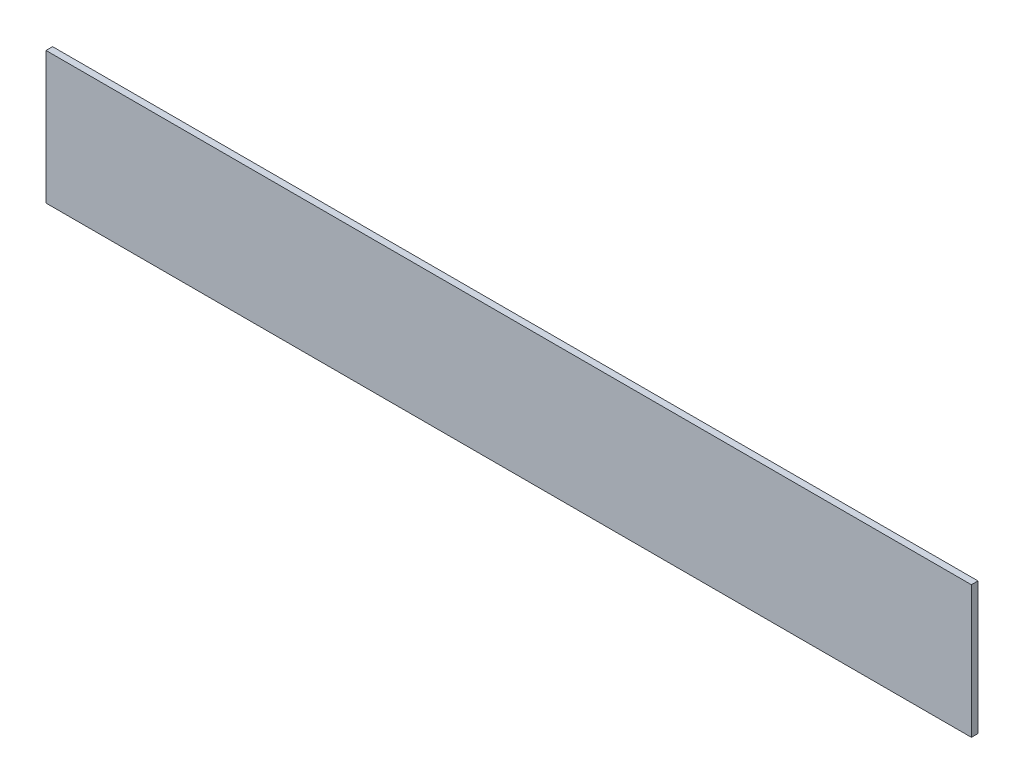
ISO-10303-21;
HEADER;
FILE_DESCRIPTION(('STEP AP214'),'2;1');
FILE_NAME('part.step','',(''),(''),'','','');
FILE_SCHEMA(('AUTOMOTIVE_DESIGN { 1 0 10303 214 1 1 1 1 }'));
ENDSEC;
DATA;
#1=APPLICATION_CONTEXT('core data for automotive mechanical design processes');
#2=APPLICATION_PROTOCOL_DEFINITION('international standard','automotive_design',2000,#1);
#3=PRODUCT_CONTEXT('',#1,'mechanical');
#4=PRODUCT('Part','Part','',(#3));
#5=PRODUCT_RELATED_PRODUCT_CATEGORY('part','',(#4));
#6=PRODUCT_DEFINITION_FORMATION('','',#4);
#7=PRODUCT_DEFINITION_CONTEXT('part definition',#1,'design');
#8=PRODUCT_DEFINITION('design','',#6,#7);
#9=PRODUCT_DEFINITION_SHAPE('','',#8);
#10=(LENGTH_UNIT() NAMED_UNIT(*) SI_UNIT(.MILLI.,.METRE.));
#11=(NAMED_UNIT(*) PLANE_ANGLE_UNIT() SI_UNIT($,.RADIAN.));
#12=(NAMED_UNIT(*) SI_UNIT($,.STERADIAN.) SOLID_ANGLE_UNIT());
#13=UNCERTAINTY_MEASURE_WITH_UNIT(LENGTH_MEASURE(1.E-05),#10,'distance_accuracy_value','');
#14=(GEOMETRIC_REPRESENTATION_CONTEXT(3) GLOBAL_UNCERTAINTY_ASSIGNED_CONTEXT((#13)) GLOBAL_UNIT_ASSIGNED_CONTEXT((#10,
#11,#12)) REPRESENTATION_CONTEXT('',''));
#15=CARTESIAN_POINT('',(0.,0.,0.));
#16=DIRECTION('',(0.,0.,1.));
#17=DIRECTION('',(1.,0.,0.));
#18=AXIS2_PLACEMENT_3D('',#15,#16,#17);
#19=CARTESIAN_POINT('',(210.,360.,-301.));
#20=DIRECTION('',(-1.,0.,0.));
#21=DIRECTION('',(0.,0.,1.));
#22=AXIS2_PLACEMENT_3D('',#19,#20,#21);
#23=PLANE('',#22);
#24=DIRECTION('',(0.,-1.,0.));
#25=VECTOR('',#24,1.);
#26=CARTESIAN_POINT('',(210.,360.,-299.));
#27=LINE('',#26,#25);
#28=CARTESIAN_POINT('',(210.,400.,-299.));
#29=VERTEX_POINT('',#28);
#30=CARTESIAN_POINT('',(210.,360.,-299.));
#31=VERTEX_POINT('',#30);
#32=EDGE_CURVE('E103',#29,#31,#27,.T.);
#33=ORIENTED_EDGE('',*,*,#32,.F.);
#34=DIRECTION('',(0.,0.,1.));
#35=VECTOR('',#34,1.);
#36=CARTESIAN_POINT('',(210.,400.,-301.));
#37=LINE('',#36,#35);
#38=CARTESIAN_POINT('',(210.,400.,-301.));
#39=VERTEX_POINT('',#38);
#40=EDGE_CURVE('E11',#39,#29,#37,.T.);
#41=ORIENTED_EDGE('',*,*,#40,.F.);
#42=DIRECTION('',(0.,-1.,0.));
#43=VECTOR('',#42,1.);
#44=CARTESIAN_POINT('',(210.,360.,-301.));
#45=LINE('',#44,#43);
#46=CARTESIAN_POINT('',(210.,360.,-301.));
#47=VERTEX_POINT('',#46);
#48=EDGE_CURVE('E97',#39,#47,#45,.T.);
#49=ORIENTED_EDGE('',*,*,#48,.T.);
#50=DIRECTION('',(0.,0.,1.));
#51=VECTOR('',#50,1.);
#52=CARTESIAN_POINT('',(210.,360.,-301.));
#53=LINE('',#52,#51);
#54=EDGE_CURVE('E42',#47,#31,#53,.T.);
#55=ORIENTED_EDGE('',*,*,#54,.T.);
#56=EDGE_LOOP('',(#33,#41,#49,#55));
#57=FACE_BOUND('',#56,.T.);
#58=ADVANCED_FACE('F39',(#57),#23,.T.);
#59=CARTESIAN_POINT('',(210.,400.,-301.));
#60=DIRECTION('',(0.,1.,0.));
#61=DIRECTION('',(0.,0.,1.));
#62=AXIS2_PLACEMENT_3D('',#59,#60,#61);
#63=PLANE('',#62);
#64=DIRECTION('',(-1.,0.,0.));
#65=VECTOR('',#64,1.);
#66=CARTESIAN_POINT('',(210.,400.,-299.));
#67=LINE('',#66,#65);
#68=CARTESIAN_POINT('',(490.,400.,-299.));
#69=VERTEX_POINT('',#68);
#70=EDGE_CURVE('E99',#69,#29,#67,.T.);
#71=ORIENTED_EDGE('',*,*,#70,.F.);
#72=DIRECTION('',(0.,0.,1.));
#73=VECTOR('',#72,1.);
#74=CARTESIAN_POINT('',(490.,400.,-301.));
#75=LINE('',#74,#73);
#76=CARTESIAN_POINT('',(490.,400.,-301.));
#77=VERTEX_POINT('',#76);
#78=EDGE_CURVE('E48',#77,#69,#75,.T.);
#79=ORIENTED_EDGE('',*,*,#78,.F.);
#80=DIRECTION('',(-1.,0.,0.));
#81=VECTOR('',#80,1.);
#82=CARTESIAN_POINT('',(210.,400.,-301.));
#83=LINE('',#82,#81);
#84=EDGE_CURVE('E94',#77,#39,#83,.T.);
#85=ORIENTED_EDGE('',*,*,#84,.T.);
#86=ORIENTED_EDGE('',*,*,#40,.T.);
#87=EDGE_LOOP('',(#71,#79,#85,#86));
#88=FACE_BOUND('',#87,.T.);
#89=ADVANCED_FACE('F113',(#88),#63,.T.);
#90=CARTESIAN_POINT('',(490.,360.,-301.));
#91=DIRECTION('',(1.,0.,0.));
#92=DIRECTION('',(0.,0.,-1.));
#93=AXIS2_PLACEMENT_3D('',#90,#91,#92);
#94=PLANE('',#93);
#95=DIRECTION('',(0.,1.,0.));
#96=VECTOR('',#95,1.);
#97=CARTESIAN_POINT('',(490.,360.,-299.));
#98=LINE('',#97,#96);
#99=CARTESIAN_POINT('',(490.,360.,-299.));
#100=VERTEX_POINT('',#99);
#101=EDGE_CURVE('E89',#100,#69,#98,.T.);
#102=ORIENTED_EDGE('',*,*,#101,.F.);
#103=DIRECTION('',(0.,0.,1.));
#104=VECTOR('',#103,1.);
#105=CARTESIAN_POINT('',(490.,360.,-301.));
#106=LINE('',#105,#104);
#107=CARTESIAN_POINT('',(490.,360.,-301.));
#108=VERTEX_POINT('',#107);
#109=EDGE_CURVE('E84',#108,#100,#106,.T.);
#110=ORIENTED_EDGE('',*,*,#109,.F.);
#111=DIRECTION('',(0.,1.,0.));
#112=VECTOR('',#111,1.);
#113=CARTESIAN_POINT('',(490.,360.,-301.));
#114=LINE('',#113,#112);
#115=EDGE_CURVE('E87',#108,#77,#114,.T.);
#116=ORIENTED_EDGE('',*,*,#115,.T.);
#117=ORIENTED_EDGE('',*,*,#78,.T.);
#118=EDGE_LOOP('',(#102,#110,#116,#117));
#119=FACE_BOUND('',#118,.T.);
#120=ADVANCED_FACE('F86',(#119),#94,.T.);
#121=CARTESIAN_POINT('',(210.,360.,-301.));
#122=DIRECTION('',(0.,-1.,0.));
#123=DIRECTION('',(0.,0.,-1.));
#124=AXIS2_PLACEMENT_3D('',#121,#122,#123);
#125=PLANE('',#124);
#126=DIRECTION('',(1.,0.,0.));
#127=VECTOR('',#126,1.);
#128=CARTESIAN_POINT('',(210.,360.,-299.));
#129=LINE('',#128,#127);
#130=EDGE_CURVE('E106',#31,#100,#129,.T.);
#131=ORIENTED_EDGE('',*,*,#130,.F.);
#132=ORIENTED_EDGE('',*,*,#54,.F.);
#133=DIRECTION('',(1.,0.,0.));
#134=VECTOR('',#133,1.);
#135=CARTESIAN_POINT('',(210.,360.,-301.));
#136=LINE('',#135,#134);
#137=EDGE_CURVE('E93',#47,#108,#136,.T.);
#138=ORIENTED_EDGE('',*,*,#137,.T.);
#139=ORIENTED_EDGE('',*,*,#109,.T.);
#140=EDGE_LOOP('',(#131,#132,#138,#139));
#141=FACE_BOUND('',#140,.T.);
#142=ADVANCED_FACE('F96',(#141),#125,.T.);
#143=CARTESIAN_POINT('',(0.,0.,-301.));
#144=DIRECTION('',(0.,0.,-1.));
#145=DIRECTION('',(-1.,0.,0.));
#146=AXIS2_PLACEMENT_3D('',#143,#144,#145);
#147=PLANE('',#146);
#148=ORIENTED_EDGE('',*,*,#48,.F.);
#149=ORIENTED_EDGE('',*,*,#84,.F.);
#150=ORIENTED_EDGE('',*,*,#115,.F.);
#151=ORIENTED_EDGE('',*,*,#137,.F.);
#152=EDGE_LOOP('',(#148,#149,#150,#151));
#153=FACE_BOUND('',#152,.T.);
#154=ADVANCED_FACE('F92',(#153),#147,.T.);
#155=CARTESIAN_POINT('',(0.,0.,-299.));
#156=DIRECTION('',(0.,0.,-1.));
#157=DIRECTION('',(-1.,0.,0.));
#158=AXIS2_PLACEMENT_3D('',#155,#156,#157);
#159=PLANE('',#158);
#160=ORIENTED_EDGE('',*,*,#32,.T.);
#161=ORIENTED_EDGE('',*,*,#130,.T.);
#162=ORIENTED_EDGE('',*,*,#101,.T.);
#163=ORIENTED_EDGE('',*,*,#70,.T.);
#164=EDGE_LOOP('',(#160,#161,#162,#163));
#165=FACE_BOUND('',#164,.T.);
#166=ADVANCED_FACE('F112',(#165),#159,.F.);
#167=CLOSED_SHELL('',(#58,#89,#120,#142,#154,#166));
#168=MANIFOLD_SOLID_BREP('B2',#167);
#169=ADVANCED_BREP_SHAPE_REPRESENTATION('',(#18,#168),#14);
#170=SHAPE_DEFINITION_REPRESENTATION(#9,#169);
ENDSEC;
END-ISO-10303-21;
